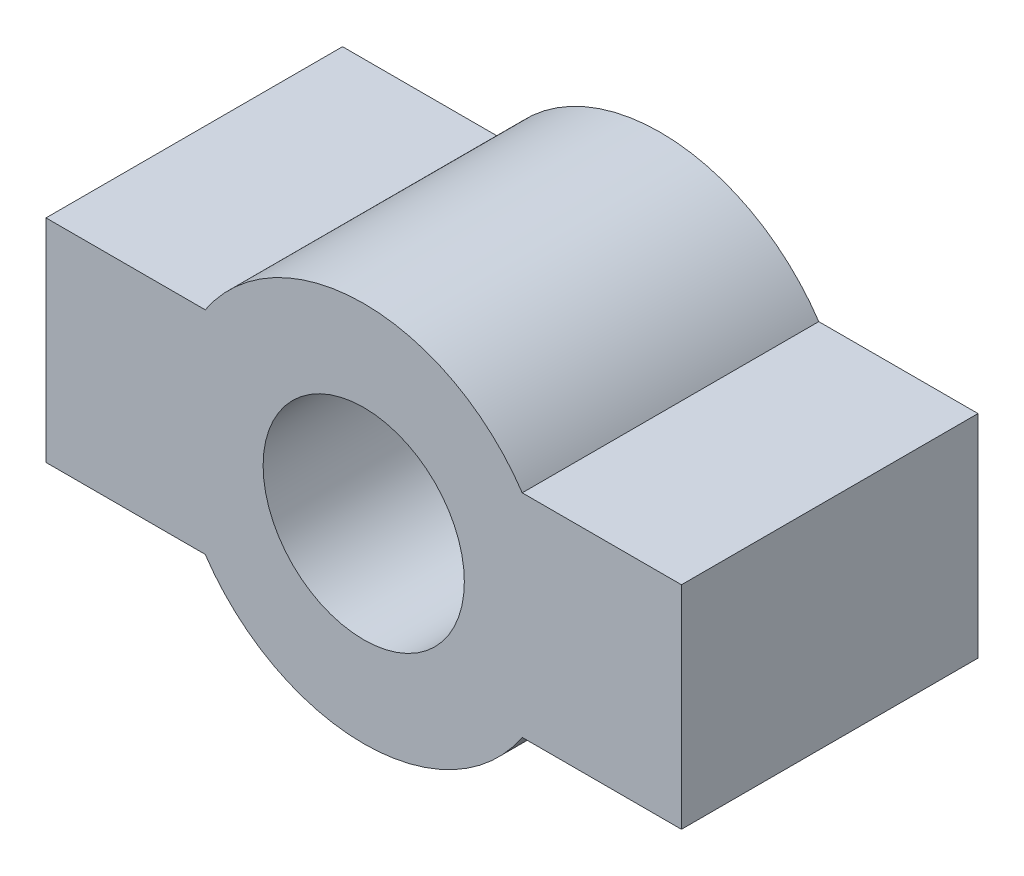
ISO-10303-21;
HEADER;
FILE_DESCRIPTION(('STEP AP214'),'2;1');
FILE_NAME('part.step','',(''),(''),'','','');
FILE_SCHEMA(('AUTOMOTIVE_DESIGN { 1 0 10303 214 1 1 1 1 }'));
ENDSEC;
DATA;
#1=APPLICATION_CONTEXT('core data for automotive mechanical design processes');
#2=APPLICATION_PROTOCOL_DEFINITION('international standard','automotive_design',2000,#1);
#3=PRODUCT_CONTEXT('',#1,'mechanical');
#4=PRODUCT('Part','Part','',(#3));
#5=PRODUCT_RELATED_PRODUCT_CATEGORY('part','',(#4));
#6=PRODUCT_DEFINITION_FORMATION('','',#4);
#7=PRODUCT_DEFINITION_CONTEXT('part definition',#1,'design');
#8=PRODUCT_DEFINITION('design','',#6,#7);
#9=PRODUCT_DEFINITION_SHAPE('','',#8);
#10=(LENGTH_UNIT() NAMED_UNIT(*) SI_UNIT(.MILLI.,.METRE.));
#11=(NAMED_UNIT(*) PLANE_ANGLE_UNIT() SI_UNIT($,.RADIAN.));
#12=(NAMED_UNIT(*) SI_UNIT($,.STERADIAN.) SOLID_ANGLE_UNIT());
#13=UNCERTAINTY_MEASURE_WITH_UNIT(LENGTH_MEASURE(1.E-05),#10,'distance_accuracy_value','');
#14=(GEOMETRIC_REPRESENTATION_CONTEXT(3) GLOBAL_UNCERTAINTY_ASSIGNED_CONTEXT((#13)) GLOBAL_UNIT_ASSIGNED_CONTEXT((#10,
#11,#12)) REPRESENTATION_CONTEXT('',''));
#15=CARTESIAN_POINT('',(0.,0.,0.));
#16=DIRECTION('',(0.,0.,1.));
#17=DIRECTION('',(1.,0.,0.));
#18=AXIS2_PLACEMENT_3D('',#15,#16,#17);
#19=CARTESIAN_POINT('',(0.,0.,28.));
#20=DIRECTION('',(0.,0.,1.));
#21=DIRECTION('',(1.,0.,0.));
#22=AXIS2_PLACEMENT_3D('',#19,#20,#21);
#23=PLANE('',#22);
#24=DIRECTION('',(0.,-1.,0.));
#25=VECTOR('',#24,1.);
#26=CARTESIAN_POINT('',(-30.,10.,28.));
#27=LINE('',#26,#25);
#28=CARTESIAN_POINT('',(-30.,10.,28.));
#29=VERTEX_POINT('',#28);
#30=CARTESIAN_POINT('',(-30.,-10.,28.));
#31=VERTEX_POINT('',#30);
#32=EDGE_CURVE('E138',#29,#31,#27,.T.);
#33=ORIENTED_EDGE('',*,*,#32,.T.);
#34=DIRECTION('',(1.,0.,0.));
#35=VECTOR('',#34,1.);
#36=CARTESIAN_POINT('',(-30.,-10.,28.));
#37=LINE('',#36,#35);
#38=CARTESIAN_POINT('',(-14.9666295470958,-9.99999999999999,28.));
#39=VERTEX_POINT('',#38);
#40=EDGE_CURVE('E115',#31,#39,#37,.T.);
#41=ORIENTED_EDGE('',*,*,#40,.T.);
#42=CARTESIAN_POINT('',(0.,0.,28.));
#43=DIRECTION('',(0.,0.,1.));
#44=DIRECTION('',(1.,0.,0.));
#45=AXIS2_PLACEMENT_3D('',#42,#43,#44);
#46=CIRCLE('',#45,18.);
#47=CARTESIAN_POINT('',(14.9666295470958,-10.,28.));
#48=VERTEX_POINT('',#47);
#49=EDGE_CURVE('E141',#39,#48,#46,.T.);
#50=ORIENTED_EDGE('',*,*,#49,.T.);
#51=DIRECTION('',(1.,0.,0.));
#52=VECTOR('',#51,1.);
#53=CARTESIAN_POINT('',(14.9666295470958,-10.,28.));
#54=LINE('',#53,#52);
#55=CARTESIAN_POINT('',(30.,-10.,28.));
#56=VERTEX_POINT('',#55);
#57=EDGE_CURVE('E143',#48,#56,#54,.T.);
#58=ORIENTED_EDGE('',*,*,#57,.T.);
#59=DIRECTION('',(0.,1.,0.));
#60=VECTOR('',#59,1.);
#61=CARTESIAN_POINT('',(30.,10.,28.));
#62=LINE('',#61,#60);
#63=CARTESIAN_POINT('',(30.,10.,28.));
#64=VERTEX_POINT('',#63);
#65=EDGE_CURVE('E145',#56,#64,#62,.T.);
#66=ORIENTED_EDGE('',*,*,#65,.T.);
#67=DIRECTION('',(-1.,0.,0.));
#68=VECTOR('',#67,1.);
#69=CARTESIAN_POINT('',(14.9666295470958,10.,28.));
#70=LINE('',#69,#68);
#71=CARTESIAN_POINT('',(14.9666295470958,10.,28.));
#72=VERTEX_POINT('',#71);
#73=EDGE_CURVE('E147',#64,#72,#70,.T.);
#74=ORIENTED_EDGE('',*,*,#73,.T.);
#75=CARTESIAN_POINT('',(0.,0.,28.));
#76=DIRECTION('',(0.,0.,1.));
#77=DIRECTION('',(1.,0.,0.));
#78=AXIS2_PLACEMENT_3D('',#75,#76,#77);
#79=CIRCLE('',#78,18.);
#80=CARTESIAN_POINT('',(-14.9666295470958,10.,28.));
#81=VERTEX_POINT('',#80);
#82=EDGE_CURVE('E56',#72,#81,#79,.T.);
#83=ORIENTED_EDGE('',*,*,#82,.T.);
#84=DIRECTION('',(-1.,0.,0.));
#85=VECTOR('',#84,1.);
#86=CARTESIAN_POINT('',(-30.,10.,28.));
#87=LINE('',#86,#85);
#88=EDGE_CURVE('E51',#81,#29,#87,.T.);
#89=ORIENTED_EDGE('',*,*,#88,.T.);
#90=EDGE_LOOP('',(#33,#41,#50,#58,#66,#74,#83,#89));
#91=FACE_BOUND('',#90,.T.);
#92=CARTESIAN_POINT('',(0.,0.,28.));
#93=DIRECTION('',(0.,0.,1.));
#94=DIRECTION('',(1.,0.,0.));
#95=AXIS2_PLACEMENT_3D('',#92,#93,#94);
#96=CIRCLE('',#95,9.5);
#97=CARTESIAN_POINT('',(9.5,0.,28.));
#98=VERTEX_POINT('',#97);
#99=EDGE_CURVE('E120',#98,#98,#96,.T.);
#100=ORIENTED_EDGE('',*,*,#99,.F.);
#101=EDGE_LOOP('',(#100));
#102=FACE_BOUND('',#101,.T.);
#103=ADVANCED_FACE('F36',(#91,#102),#23,.T.);
#104=CARTESIAN_POINT('',(0.,0.,0.));
#105=DIRECTION('',(0.,0.,1.));
#106=DIRECTION('',(1.,0.,0.));
#107=AXIS2_PLACEMENT_3D('',#104,#105,#106);
#108=PLANE('',#107);
#109=DIRECTION('',(0.,-1.,0.));
#110=VECTOR('',#109,1.);
#111=CARTESIAN_POINT('',(-30.,10.,0.));
#112=LINE('',#111,#110);
#113=CARTESIAN_POINT('',(-30.,10.,0.));
#114=VERTEX_POINT('',#113);
#115=CARTESIAN_POINT('',(-30.,-10.,0.));
#116=VERTEX_POINT('',#115);
#117=EDGE_CURVE('E106',#114,#116,#112,.T.);
#118=ORIENTED_EDGE('',*,*,#117,.F.);
#119=DIRECTION('',(-1.,0.,0.));
#120=VECTOR('',#119,1.);
#121=CARTESIAN_POINT('',(-30.,10.,0.));
#122=LINE('',#121,#120);
#123=CARTESIAN_POINT('',(-14.9666295470958,10.,0.));
#124=VERTEX_POINT('',#123);
#125=EDGE_CURVE('E136',#124,#114,#122,.T.);
#126=ORIENTED_EDGE('',*,*,#125,.F.);
#127=CARTESIAN_POINT('',(0.,0.,0.));
#128=DIRECTION('',(0.,0.,1.));
#129=DIRECTION('',(1.,0.,0.));
#130=AXIS2_PLACEMENT_3D('',#127,#128,#129);
#131=CIRCLE('',#130,18.);
#132=CARTESIAN_POINT('',(14.9666295470958,10.,0.));
#133=VERTEX_POINT('',#132);
#134=EDGE_CURVE('E134',#133,#124,#131,.T.);
#135=ORIENTED_EDGE('',*,*,#134,.F.);
#136=DIRECTION('',(-1.,0.,0.));
#137=VECTOR('',#136,1.);
#138=CARTESIAN_POINT('',(14.9666295470958,10.,0.));
#139=LINE('',#138,#137);
#140=CARTESIAN_POINT('',(30.,10.,0.));
#141=VERTEX_POINT('',#140);
#142=EDGE_CURVE('E132',#141,#133,#139,.T.);
#143=ORIENTED_EDGE('',*,*,#142,.F.);
#144=DIRECTION('',(0.,1.,0.));
#145=VECTOR('',#144,1.);
#146=CARTESIAN_POINT('',(30.,10.,0.));
#147=LINE('',#146,#145);
#148=CARTESIAN_POINT('',(30.,-10.,0.));
#149=VERTEX_POINT('',#148);
#150=EDGE_CURVE('E130',#149,#141,#147,.T.);
#151=ORIENTED_EDGE('',*,*,#150,.F.);
#152=DIRECTION('',(1.,0.,0.));
#153=VECTOR('',#152,1.);
#154=CARTESIAN_POINT('',(14.9666295470958,-10.,0.));
#155=LINE('',#154,#153);
#156=CARTESIAN_POINT('',(14.9666295470958,-10.,0.));
#157=VERTEX_POINT('',#156);
#158=EDGE_CURVE('E128',#157,#149,#155,.T.);
#159=ORIENTED_EDGE('',*,*,#158,.F.);
#160=CARTESIAN_POINT('',(0.,0.,0.));
#161=DIRECTION('',(0.,0.,1.));
#162=DIRECTION('',(1.,0.,0.));
#163=AXIS2_PLACEMENT_3D('',#160,#161,#162);
#164=CIRCLE('',#163,18.);
#165=CARTESIAN_POINT('',(-14.9666295470958,-9.99999999999999,0.));
#166=VERTEX_POINT('',#165);
#167=EDGE_CURVE('E108',#166,#157,#164,.T.);
#168=ORIENTED_EDGE('',*,*,#167,.F.);
#169=DIRECTION('',(1.,0.,0.));
#170=VECTOR('',#169,1.);
#171=CARTESIAN_POINT('',(-30.,-10.,0.));
#172=LINE('',#171,#170);
#173=EDGE_CURVE('E101',#116,#166,#172,.T.);
#174=ORIENTED_EDGE('',*,*,#173,.F.);
#175=EDGE_LOOP('',(#118,#126,#135,#143,#151,#159,#168,#174));
#176=FACE_BOUND('',#175,.T.);
#177=CARTESIAN_POINT('',(0.,0.,0.));
#178=DIRECTION('',(0.,0.,1.));
#179=DIRECTION('',(1.,0.,0.));
#180=AXIS2_PLACEMENT_3D('',#177,#178,#179);
#181=CIRCLE('',#180,9.5);
#182=CARTESIAN_POINT('',(9.5,0.,0.));
#183=VERTEX_POINT('',#182);
#184=EDGE_CURVE('E123',#183,#183,#181,.T.);
#185=ORIENTED_EDGE('',*,*,#184,.T.);
#186=EDGE_LOOP('',(#185));
#187=FACE_BOUND('',#186,.T.);
#188=ADVANCED_FACE('F102',(#176,#187),#108,.F.);
#189=CARTESIAN_POINT('',(-30.,10.,28.));
#190=DIRECTION('',(1.,0.,0.));
#191=DIRECTION('',(0.,1.,0.));
#192=AXIS2_PLACEMENT_3D('',#189,#190,#191);
#193=PLANE('',#192);
#194=ORIENTED_EDGE('',*,*,#117,.T.);
#195=DIRECTION('',(0.,0.,-1.));
#196=VECTOR('',#195,1.);
#197=CARTESIAN_POINT('',(-30.,-10.,28.));
#198=LINE('',#197,#196);
#199=EDGE_CURVE('E11',#31,#116,#198,.T.);
#200=ORIENTED_EDGE('',*,*,#199,.F.);
#201=ORIENTED_EDGE('',*,*,#32,.F.);
#202=DIRECTION('',(0.,0.,-1.));
#203=VECTOR('',#202,1.);
#204=CARTESIAN_POINT('',(-30.,10.,28.));
#205=LINE('',#204,#203);
#206=EDGE_CURVE('E119',#29,#114,#205,.T.);
#207=ORIENTED_EDGE('',*,*,#206,.T.);
#208=EDGE_LOOP('',(#194,#200,#201,#207));
#209=FACE_BOUND('',#208,.T.);
#210=ADVANCED_FACE('F38',(#209),#193,.F.);
#211=CARTESIAN_POINT('',(-30.,-10.,28.));
#212=DIRECTION('',(0.,1.,0.));
#213=DIRECTION('',(-1.,0.,0.));
#214=AXIS2_PLACEMENT_3D('',#211,#212,#213);
#215=PLANE('',#214);
#216=ORIENTED_EDGE('',*,*,#173,.T.);
#217=DIRECTION('',(0.,0.,-1.));
#218=VECTOR('',#217,1.);
#219=CARTESIAN_POINT('',(-14.9666295470958,-9.99999999999999,28.));
#220=LINE('',#219,#218);
#221=EDGE_CURVE('E44',#39,#166,#220,.T.);
#222=ORIENTED_EDGE('',*,*,#221,.F.);
#223=ORIENTED_EDGE('',*,*,#40,.F.);
#224=ORIENTED_EDGE('',*,*,#199,.T.);
#225=EDGE_LOOP('',(#216,#222,#223,#224));
#226=FACE_BOUND('',#225,.T.);
#227=ADVANCED_FACE('F114',(#226),#215,.F.);
#228=CARTESIAN_POINT('',(0.,0.,28.));
#229=DIRECTION('',(0.,0.,-1.));
#230=DIRECTION('',(-1.,0.,0.));
#231=AXIS2_PLACEMENT_3D('',#228,#229,#230);
#232=CYLINDRICAL_SURFACE('',#231,18.);
#233=ORIENTED_EDGE('',*,*,#167,.T.);
#234=DIRECTION('',(0.,0.,-1.));
#235=VECTOR('',#234,1.);
#236=CARTESIAN_POINT('',(14.9666295470958,-10.,28.));
#237=LINE('',#236,#235);
#238=EDGE_CURVE('E164',#48,#157,#237,.T.);
#239=ORIENTED_EDGE('',*,*,#238,.F.);
#240=ORIENTED_EDGE('',*,*,#49,.F.);
#241=ORIENTED_EDGE('',*,*,#221,.T.);
#242=EDGE_LOOP('',(#233,#239,#240,#241));
#243=FACE_BOUND('',#242,.T.);
#244=ADVANCED_FACE('F168',(#243),#232,.T.);
#245=CARTESIAN_POINT('',(14.9666295470958,-10.,28.));
#246=DIRECTION('',(0.,1.,0.));
#247=DIRECTION('',(0.,0.,1.));
#248=AXIS2_PLACEMENT_3D('',#245,#246,#247);
#249=PLANE('',#248);
#250=ORIENTED_EDGE('',*,*,#158,.T.);
#251=DIRECTION('',(0.,0.,-1.));
#252=VECTOR('',#251,1.);
#253=CARTESIAN_POINT('',(30.,-10.,28.));
#254=LINE('',#253,#252);
#255=EDGE_CURVE('E161',#56,#149,#254,.T.);
#256=ORIENTED_EDGE('',*,*,#255,.F.);
#257=ORIENTED_EDGE('',*,*,#57,.F.);
#258=ORIENTED_EDGE('',*,*,#238,.T.);
#259=EDGE_LOOP('',(#250,#256,#257,#258));
#260=FACE_BOUND('',#259,.T.);
#261=ADVANCED_FACE('F176',(#260),#249,.F.);
#262=CARTESIAN_POINT('',(30.,10.,28.));
#263=DIRECTION('',(-1.,0.,0.));
#264=DIRECTION('',(0.,0.,1.));
#265=AXIS2_PLACEMENT_3D('',#262,#263,#264);
#266=PLANE('',#265);
#267=ORIENTED_EDGE('',*,*,#150,.T.);
#268=DIRECTION('',(0.,0.,-1.));
#269=VECTOR('',#268,1.);
#270=CARTESIAN_POINT('',(30.,10.,28.));
#271=LINE('',#270,#269);
#272=EDGE_CURVE('E158',#64,#141,#271,.T.);
#273=ORIENTED_EDGE('',*,*,#272,.F.);
#274=ORIENTED_EDGE('',*,*,#65,.F.);
#275=ORIENTED_EDGE('',*,*,#255,.T.);
#276=EDGE_LOOP('',(#267,#273,#274,#275));
#277=FACE_BOUND('',#276,.T.);
#278=ADVANCED_FACE('F179',(#277),#266,.F.);
#279=CARTESIAN_POINT('',(14.9666295470958,10.,28.));
#280=DIRECTION('',(0.,-1.,0.));
#281=DIRECTION('',(0.,0.,-1.));
#282=AXIS2_PLACEMENT_3D('',#279,#280,#281);
#283=PLANE('',#282);
#284=ORIENTED_EDGE('',*,*,#142,.T.);
#285=DIRECTION('',(0.,0.,-1.));
#286=VECTOR('',#285,1.);
#287=CARTESIAN_POINT('',(14.9666295470958,10.,28.));
#288=LINE('',#287,#286);
#289=EDGE_CURVE('E155',#72,#133,#288,.T.);
#290=ORIENTED_EDGE('',*,*,#289,.F.);
#291=ORIENTED_EDGE('',*,*,#73,.F.);
#292=ORIENTED_EDGE('',*,*,#272,.T.);
#293=EDGE_LOOP('',(#284,#290,#291,#292));
#294=FACE_BOUND('',#293,.T.);
#295=ADVANCED_FACE('F184',(#294),#283,.F.);
#296=CARTESIAN_POINT('',(0.,0.,28.));
#297=DIRECTION('',(0.,0.,-1.));
#298=DIRECTION('',(-1.,0.,0.));
#299=AXIS2_PLACEMENT_3D('',#296,#297,#298);
#300=CYLINDRICAL_SURFACE('',#299,18.);
#301=ORIENTED_EDGE('',*,*,#134,.T.);
#302=DIRECTION('',(0.,0.,-1.));
#303=VECTOR('',#302,1.);
#304=CARTESIAN_POINT('',(-14.9666295470958,10.,28.));
#305=LINE('',#304,#303);
#306=EDGE_CURVE('E152',#81,#124,#305,.T.);
#307=ORIENTED_EDGE('',*,*,#306,.F.);
#308=ORIENTED_EDGE('',*,*,#82,.F.);
#309=ORIENTED_EDGE('',*,*,#289,.T.);
#310=EDGE_LOOP('',(#301,#307,#308,#309));
#311=FACE_BOUND('',#310,.T.);
#312=ADVANCED_FACE('F187',(#311),#300,.T.);
#313=CARTESIAN_POINT('',(-30.,10.,28.));
#314=DIRECTION('',(0.,-1.,0.));
#315=DIRECTION('',(0.,0.,-1.));
#316=AXIS2_PLACEMENT_3D('',#313,#314,#315);
#317=PLANE('',#316);
#318=ORIENTED_EDGE('',*,*,#125,.T.);
#319=ORIENTED_EDGE('',*,*,#206,.F.);
#320=ORIENTED_EDGE('',*,*,#88,.F.);
#321=ORIENTED_EDGE('',*,*,#306,.T.);
#322=EDGE_LOOP('',(#318,#319,#320,#321));
#323=FACE_BOUND('',#322,.T.);
#324=ADVANCED_FACE('F189',(#323),#317,.F.);
#325=CARTESIAN_POINT('',(0.,0.,28.));
#326=DIRECTION('',(0.,0.,-1.));
#327=DIRECTION('',(-1.,0.,0.));
#328=AXIS2_PLACEMENT_3D('',#325,#326,#327);
#329=CYLINDRICAL_SURFACE('',#328,9.5);
#330=ORIENTED_EDGE('',*,*,#99,.T.);
#331=EDGE_LOOP('',(#330));
#332=FACE_BOUND('',#331,.T.);
#333=ORIENTED_EDGE('',*,*,#184,.F.);
#334=EDGE_LOOP('',(#333));
#335=FACE_BOUND('',#334,.T.);
#336=ADVANCED_FACE('F191',(#332,#335),#329,.F.);
#337=CLOSED_SHELL('',(#103,#188,#210,#227,#244,#261,#278,#295,#312,#324,#336));
#338=MANIFOLD_SOLID_BREP('B2',#337);
#339=ADVANCED_BREP_SHAPE_REPRESENTATION('',(#18,#338),#14);
#340=SHAPE_DEFINITION_REPRESENTATION(#9,#339);
ENDSEC;
END-ISO-10303-21;
